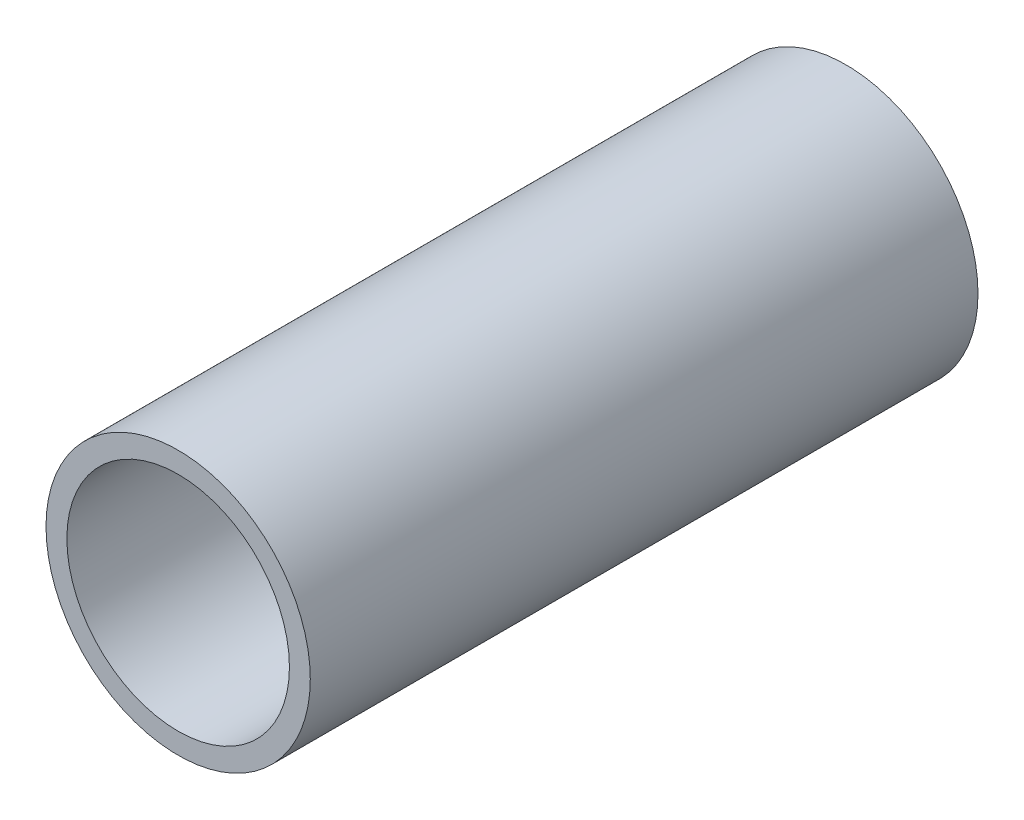
ISO-10303-21;
HEADER;
FILE_DESCRIPTION(('STEP AP214'),'2;1');
FILE_NAME('part.step','',(''),(''),'','','');
FILE_SCHEMA(('AUTOMOTIVE_DESIGN { 1 0 10303 214 1 1 1 1 }'));
ENDSEC;
DATA;
#1=APPLICATION_CONTEXT('core data for automotive mechanical design processes');
#2=APPLICATION_PROTOCOL_DEFINITION('international standard','automotive_design',2000,#1);
#3=PRODUCT_CONTEXT('',#1,'mechanical');
#4=PRODUCT('Part','Part','',(#3));
#5=PRODUCT_RELATED_PRODUCT_CATEGORY('part','',(#4));
#6=PRODUCT_DEFINITION_FORMATION('','',#4);
#7=PRODUCT_DEFINITION_CONTEXT('part definition',#1,'design');
#8=PRODUCT_DEFINITION('design','',#6,#7);
#9=PRODUCT_DEFINITION_SHAPE('','',#8);
#10=(LENGTH_UNIT() NAMED_UNIT(*) SI_UNIT(.MILLI.,.METRE.));
#11=(NAMED_UNIT(*) PLANE_ANGLE_UNIT() SI_UNIT($,.RADIAN.));
#12=(NAMED_UNIT(*) SI_UNIT($,.STERADIAN.) SOLID_ANGLE_UNIT());
#13=UNCERTAINTY_MEASURE_WITH_UNIT(LENGTH_MEASURE(1.E-05),#10,'distance_accuracy_value','');
#14=(GEOMETRIC_REPRESENTATION_CONTEXT(3) GLOBAL_UNCERTAINTY_ASSIGNED_CONTEXT((#13)) GLOBAL_UNIT_ASSIGNED_CONTEXT((#10,
#11,#12)) REPRESENTATION_CONTEXT('',''));
#15=CARTESIAN_POINT('',(0.,0.,0.));
#16=DIRECTION('',(0.,0.,1.));
#17=DIRECTION('',(1.,0.,0.));
#18=AXIS2_PLACEMENT_3D('',#15,#16,#17);
#19=CARTESIAN_POINT('',(0.,0.,160.));
#20=DIRECTION('',(0.,0.,1.));
#21=DIRECTION('',(1.,0.,0.));
#22=AXIS2_PLACEMENT_3D('',#19,#20,#21);
#23=PLANE('',#22);
#24=CARTESIAN_POINT('',(0.,0.,160.));
#25=DIRECTION('',(0.,0.,1.));
#26=DIRECTION('',(1.,0.,0.));
#27=AXIS2_PLACEMENT_3D('',#24,#25,#26);
#28=CIRCLE('',#27,31.6665);
#29=CARTESIAN_POINT('',(31.6665,0.,160.));
#30=VERTEX_POINT('',#29);
#31=EDGE_CURVE('E10',#30,#30,#28,.T.);
#32=ORIENTED_EDGE('',*,*,#31,.T.);
#33=EDGE_LOOP('',(#32));
#34=FACE_BOUND('',#33,.T.);
#35=CARTESIAN_POINT('',(0.,0.,160.));
#36=DIRECTION('',(0.,0.,1.));
#37=DIRECTION('',(1.,0.,0.));
#38=AXIS2_PLACEMENT_3D('',#35,#36,#37);
#39=CIRCLE('',#38,26.6665);
#40=CARTESIAN_POINT('',(26.6665,0.,160.));
#41=VERTEX_POINT('',#40);
#42=EDGE_CURVE('E50',#41,#41,#39,.T.);
#43=ORIENTED_EDGE('',*,*,#42,.F.);
#44=EDGE_LOOP('',(#43));
#45=FACE_BOUND('',#44,.T.);
#46=ADVANCED_FACE('F37',(#34,#45),#23,.T.);
#47=CARTESIAN_POINT('',(0.,0.,0.));
#48=DIRECTION('',(0.,0.,1.));
#49=DIRECTION('',(1.,0.,0.));
#50=AXIS2_PLACEMENT_3D('',#47,#48,#49);
#51=PLANE('',#50);
#52=CARTESIAN_POINT('',(0.,0.,0.));
#53=DIRECTION('',(0.,0.,1.));
#54=DIRECTION('',(1.,0.,0.));
#55=AXIS2_PLACEMENT_3D('',#52,#53,#54);
#56=CIRCLE('',#55,31.6665);
#57=CARTESIAN_POINT('',(31.6665,0.,0.));
#58=VERTEX_POINT('',#57);
#59=EDGE_CURVE('E41',#58,#58,#56,.T.);
#60=ORIENTED_EDGE('',*,*,#59,.F.);
#61=EDGE_LOOP('',(#60));
#62=FACE_BOUND('',#61,.T.);
#63=CARTESIAN_POINT('',(0.,0.,0.));
#64=DIRECTION('',(0.,0.,1.));
#65=DIRECTION('',(1.,0.,0.));
#66=AXIS2_PLACEMENT_3D('',#63,#64,#65);
#67=CIRCLE('',#66,26.6665);
#68=CARTESIAN_POINT('',(26.6665,0.,0.));
#69=VERTEX_POINT('',#68);
#70=EDGE_CURVE('E52',#69,#69,#67,.T.);
#71=ORIENTED_EDGE('',*,*,#70,.T.);
#72=EDGE_LOOP('',(#71));
#73=FACE_BOUND('',#72,.T.);
#74=ADVANCED_FACE('F64',(#62,#73),#51,.F.);
#75=CARTESIAN_POINT('',(0.,0.,160.));
#76=DIRECTION('',(0.,0.,-1.));
#77=DIRECTION('',(-1.,0.,0.));
#78=AXIS2_PLACEMENT_3D('',#75,#76,#77);
#79=CYLINDRICAL_SURFACE('',#78,31.6665);
#80=ORIENTED_EDGE('',*,*,#31,.F.);
#81=EDGE_LOOP('',(#80));
#82=FACE_BOUND('',#81,.T.);
#83=ORIENTED_EDGE('',*,*,#59,.T.);
#84=EDGE_LOOP('',(#83));
#85=FACE_BOUND('',#84,.T.);
#86=ADVANCED_FACE('F39',(#82,#85),#79,.T.);
#87=CARTESIAN_POINT('',(0.,0.,160.));
#88=DIRECTION('',(0.,0.,-1.));
#89=DIRECTION('',(-1.,0.,0.));
#90=AXIS2_PLACEMENT_3D('',#87,#88,#89);
#91=CYLINDRICAL_SURFACE('',#90,26.6665);
#92=ORIENTED_EDGE('',*,*,#42,.T.);
#93=EDGE_LOOP('',(#92));
#94=FACE_BOUND('',#93,.T.);
#95=ORIENTED_EDGE('',*,*,#70,.F.);
#96=EDGE_LOOP('',(#95));
#97=FACE_BOUND('',#96,.T.);
#98=ADVANCED_FACE('F60',(#94,#97),#91,.F.);
#99=CLOSED_SHELL('',(#46,#74,#86,#98));
#100=MANIFOLD_SOLID_BREP('B2',#99);
#101=ADVANCED_BREP_SHAPE_REPRESENTATION('',(#18,#100),#14);
#102=SHAPE_DEFINITION_REPRESENTATION(#9,#101);
ENDSEC;
END-ISO-10303-21;
